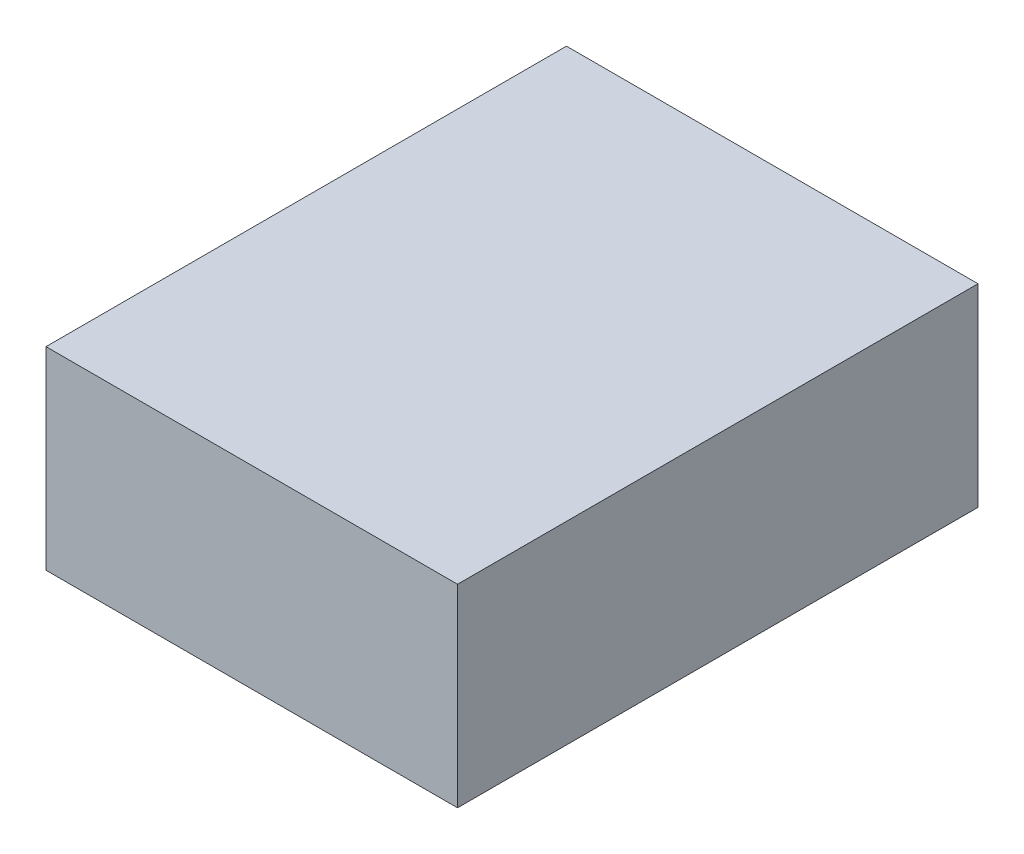
ISO-10303-21;
HEADER;
FILE_DESCRIPTION(('STEP AP214'),'2;1');
FILE_NAME('part.step','',(''),(''),'','','');
FILE_SCHEMA(('AUTOMOTIVE_DESIGN { 1 0 10303 214 1 1 1 1 }'));
ENDSEC;
DATA;
#1=APPLICATION_CONTEXT('core data for automotive mechanical design processes');
#2=APPLICATION_PROTOCOL_DEFINITION('international standard','automotive_design',2000,#1);
#3=PRODUCT_CONTEXT('',#1,'mechanical');
#4=PRODUCT('Part','Part','',(#3));
#5=PRODUCT_RELATED_PRODUCT_CATEGORY('part','',(#4));
#6=PRODUCT_DEFINITION_FORMATION('','',#4);
#7=PRODUCT_DEFINITION_CONTEXT('part definition',#1,'design');
#8=PRODUCT_DEFINITION('design','',#6,#7);
#9=PRODUCT_DEFINITION_SHAPE('','',#8);
#10=(LENGTH_UNIT() NAMED_UNIT(*) SI_UNIT(.MILLI.,.METRE.));
#11=(NAMED_UNIT(*) PLANE_ANGLE_UNIT() SI_UNIT($,.RADIAN.));
#12=(NAMED_UNIT(*) SI_UNIT($,.STERADIAN.) SOLID_ANGLE_UNIT());
#13=UNCERTAINTY_MEASURE_WITH_UNIT(LENGTH_MEASURE(1.E-05),#10,'distance_accuracy_value','');
#14=(GEOMETRIC_REPRESENTATION_CONTEXT(3) GLOBAL_UNCERTAINTY_ASSIGNED_CONTEXT((#13)) GLOBAL_UNIT_ASSIGNED_CONTEXT((#10,
#11,#12)) REPRESENTATION_CONTEXT('',''));
#15=CARTESIAN_POINT('',(0.,0.,0.));
#16=DIRECTION('',(0.,0.,1.));
#17=DIRECTION('',(1.,0.,0.));
#18=AXIS2_PLACEMENT_3D('',#15,#16,#17);
#19=CARTESIAN_POINT('',(170.,160.,-215.));
#20=DIRECTION('',(-1.,0.,0.));
#21=DIRECTION('',(0.,0.,1.));
#22=AXIS2_PLACEMENT_3D('',#19,#20,#21);
#23=PLANE('',#22);
#24=DIRECTION('',(0.,0.,-1.));
#25=VECTOR('',#24,1.);
#26=CARTESIAN_POINT('',(170.,0.,-215.));
#27=LINE('',#26,#25);
#28=CARTESIAN_POINT('',(170.,0.,215.));
#29=VERTEX_POINT('',#28);
#30=CARTESIAN_POINT('',(170.,0.,-215.));
#31=VERTEX_POINT('',#30);
#32=EDGE_CURVE('E96',#29,#31,#27,.T.);
#33=ORIENTED_EDGE('',*,*,#32,.T.);
#34=DIRECTION('',(0.,-1.,0.));
#35=VECTOR('',#34,1.);
#36=CARTESIAN_POINT('',(170.,160.,-215.));
#37=LINE('',#36,#35);
#38=CARTESIAN_POINT('',(170.,160.,-215.));
#39=VERTEX_POINT('',#38);
#40=EDGE_CURVE('E11',#39,#31,#37,.T.);
#41=ORIENTED_EDGE('',*,*,#40,.F.);
#42=DIRECTION('',(0.,0.,-1.));
#43=VECTOR('',#42,1.);
#44=CARTESIAN_POINT('',(170.,160.,-215.));
#45=LINE('',#44,#43);
#46=CARTESIAN_POINT('',(170.,160.,215.));
#47=VERTEX_POINT('',#46);
#48=EDGE_CURVE('E84',#47,#39,#45,.T.);
#49=ORIENTED_EDGE('',*,*,#48,.F.);
#50=DIRECTION('',(0.,-1.,0.));
#51=VECTOR('',#50,1.);
#52=CARTESIAN_POINT('',(170.,160.,215.));
#53=LINE('',#52,#51);
#54=EDGE_CURVE('E92',#47,#29,#53,.T.);
#55=ORIENTED_EDGE('',*,*,#54,.T.);
#56=EDGE_LOOP('',(#33,#41,#49,#55));
#57=FACE_BOUND('',#56,.T.);
#58=ADVANCED_FACE('F33',(#57),#23,.F.);
#59=CARTESIAN_POINT('',(-170.,160.,-215.));
#60=DIRECTION('',(0.,0.,1.));
#61=DIRECTION('',(1.,0.,0.));
#62=AXIS2_PLACEMENT_3D('',#59,#60,#61);
#63=PLANE('',#62);
#64=DIRECTION('',(-1.,0.,0.));
#65=VECTOR('',#64,1.);
#66=CARTESIAN_POINT('',(-170.,0.,-215.));
#67=LINE('',#66,#65);
#68=CARTESIAN_POINT('',(-170.,0.,-215.));
#69=VERTEX_POINT('',#68);
#70=EDGE_CURVE('E88',#31,#69,#67,.T.);
#71=ORIENTED_EDGE('',*,*,#70,.T.);
#72=DIRECTION('',(0.,-1.,0.));
#73=VECTOR('',#72,1.);
#74=CARTESIAN_POINT('',(-170.,160.,-215.));
#75=LINE('',#74,#73);
#76=CARTESIAN_POINT('',(-170.,160.,-215.));
#77=VERTEX_POINT('',#76);
#78=EDGE_CURVE('E41',#77,#69,#75,.T.);
#79=ORIENTED_EDGE('',*,*,#78,.F.);
#80=DIRECTION('',(-1.,0.,0.));
#81=VECTOR('',#80,1.);
#82=CARTESIAN_POINT('',(-170.,160.,-215.));
#83=LINE('',#82,#81);
#84=EDGE_CURVE('E79',#39,#77,#83,.T.);
#85=ORIENTED_EDGE('',*,*,#84,.F.);
#86=ORIENTED_EDGE('',*,*,#40,.T.);
#87=EDGE_LOOP('',(#71,#79,#85,#86));
#88=FACE_BOUND('',#87,.T.);
#89=ADVANCED_FACE('F87',(#88),#63,.F.);
#90=CARTESIAN_POINT('',(-170.,160.,-215.));
#91=DIRECTION('',(1.,0.,0.));
#92=DIRECTION('',(0.,0.,-1.));
#93=AXIS2_PLACEMENT_3D('',#90,#91,#92);
#94=PLANE('',#93);
#95=DIRECTION('',(0.,0.,1.));
#96=VECTOR('',#95,1.);
#97=CARTESIAN_POINT('',(-170.,0.,-215.));
#98=LINE('',#97,#96);
#99=CARTESIAN_POINT('',(-170.,0.,215.));
#100=VERTEX_POINT('',#99);
#101=EDGE_CURVE('E66',#69,#100,#98,.T.);
#102=ORIENTED_EDGE('',*,*,#101,.T.);
#103=DIRECTION('',(0.,-1.,0.));
#104=VECTOR('',#103,1.);
#105=CARTESIAN_POINT('',(-170.,160.,215.));
#106=LINE('',#105,#104);
#107=CARTESIAN_POINT('',(-170.,160.,215.));
#108=VERTEX_POINT('',#107);
#109=EDGE_CURVE('E89',#108,#100,#106,.T.);
#110=ORIENTED_EDGE('',*,*,#109,.F.);
#111=DIRECTION('',(0.,0.,1.));
#112=VECTOR('',#111,1.);
#113=CARTESIAN_POINT('',(-170.,160.,-215.));
#114=LINE('',#113,#112);
#115=EDGE_CURVE('E82',#77,#108,#114,.T.);
#116=ORIENTED_EDGE('',*,*,#115,.F.);
#117=ORIENTED_EDGE('',*,*,#78,.T.);
#118=EDGE_LOOP('',(#102,#110,#116,#117));
#119=FACE_BOUND('',#118,.T.);
#120=ADVANCED_FACE('F90',(#119),#94,.F.);
#121=CARTESIAN_POINT('',(-170.,160.,215.));
#122=DIRECTION('',(0.,0.,-1.));
#123=DIRECTION('',(-1.,0.,0.));
#124=AXIS2_PLACEMENT_3D('',#121,#122,#123);
#125=PLANE('',#124);
#126=DIRECTION('',(1.,0.,0.));
#127=VECTOR('',#126,1.);
#128=CARTESIAN_POINT('',(-170.,0.,215.));
#129=LINE('',#128,#127);
#130=EDGE_CURVE('E72',#100,#29,#129,.T.);
#131=ORIENTED_EDGE('',*,*,#130,.T.);
#132=ORIENTED_EDGE('',*,*,#54,.F.);
#133=DIRECTION('',(1.,0.,0.));
#134=VECTOR('',#133,1.);
#135=CARTESIAN_POINT('',(-170.,160.,215.));
#136=LINE('',#135,#134);
#137=EDGE_CURVE('E49',#108,#47,#136,.T.);
#138=ORIENTED_EDGE('',*,*,#137,.F.);
#139=ORIENTED_EDGE('',*,*,#109,.T.);
#140=EDGE_LOOP('',(#131,#132,#138,#139));
#141=FACE_BOUND('',#140,.T.);
#142=ADVANCED_FACE('F103',(#141),#125,.F.);
#143=CARTESIAN_POINT('',(0.,160.,0.));
#144=DIRECTION('',(0.,1.,0.));
#145=DIRECTION('',(0.,0.,1.));
#146=AXIS2_PLACEMENT_3D('',#143,#144,#145);
#147=PLANE('',#146);
#148=ORIENTED_EDGE('',*,*,#48,.T.);
#149=ORIENTED_EDGE('',*,*,#84,.T.);
#150=ORIENTED_EDGE('',*,*,#115,.T.);
#151=ORIENTED_EDGE('',*,*,#137,.T.);
#152=EDGE_LOOP('',(#148,#149,#150,#151));
#153=FACE_BOUND('',#152,.T.);
#154=ADVANCED_FACE('F80',(#153),#147,.T.);
#155=CARTESIAN_POINT('',(0.,0.,0.));
#156=DIRECTION('',(0.,1.,0.));
#157=DIRECTION('',(0.,0.,1.));
#158=AXIS2_PLACEMENT_3D('',#155,#156,#157);
#159=PLANE('',#158);
#160=ORIENTED_EDGE('',*,*,#32,.F.);
#161=ORIENTED_EDGE('',*,*,#130,.F.);
#162=ORIENTED_EDGE('',*,*,#101,.F.);
#163=ORIENTED_EDGE('',*,*,#70,.F.);
#164=EDGE_LOOP('',(#160,#161,#162,#163));
#165=FACE_BOUND('',#164,.T.);
#166=ADVANCED_FACE('F106',(#165),#159,.F.);
#167=CLOSED_SHELL('',(#58,#89,#120,#142,#154,#166));
#168=MANIFOLD_SOLID_BREP('B2',#167);
#169=ADVANCED_BREP_SHAPE_REPRESENTATION('',(#18,#168),#14);
#170=SHAPE_DEFINITION_REPRESENTATION(#9,#169);
ENDSEC;
END-ISO-10303-21;
